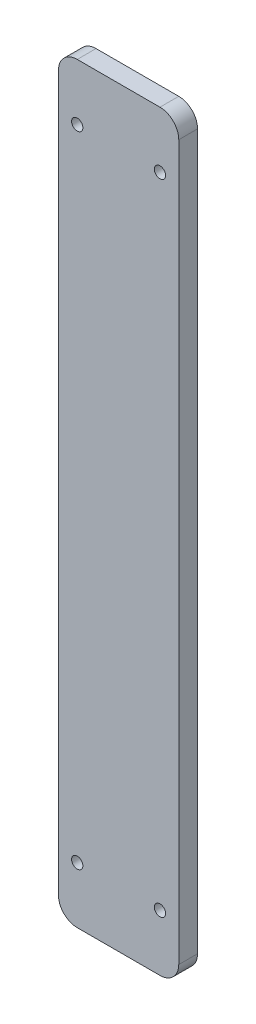
ISO-10303-21;
HEADER;
FILE_DESCRIPTION(('STEP AP214'),'2;1');
FILE_NAME('part.step','',(''),(''),'','','');
FILE_SCHEMA(('AUTOMOTIVE_DESIGN { 1 0 10303 214 1 1 1 1 }'));
ENDSEC;
DATA;
#1=APPLICATION_CONTEXT('core data for automotive mechanical design processes');
#2=APPLICATION_PROTOCOL_DEFINITION('international standard','automotive_design',2000,#1);
#3=PRODUCT_CONTEXT('',#1,'mechanical');
#4=PRODUCT('Part','Part','',(#3));
#5=PRODUCT_RELATED_PRODUCT_CATEGORY('part','',(#4));
#6=PRODUCT_DEFINITION_FORMATION('','',#4);
#7=PRODUCT_DEFINITION_CONTEXT('part definition',#1,'design');
#8=PRODUCT_DEFINITION('design','',#6,#7);
#9=PRODUCT_DEFINITION_SHAPE('','',#8);
#10=(LENGTH_UNIT() NAMED_UNIT(*) SI_UNIT(.MILLI.,.METRE.));
#11=(NAMED_UNIT(*) PLANE_ANGLE_UNIT() SI_UNIT($,.RADIAN.));
#12=(NAMED_UNIT(*) SI_UNIT($,.STERADIAN.) SOLID_ANGLE_UNIT());
#13=UNCERTAINTY_MEASURE_WITH_UNIT(LENGTH_MEASURE(1.E-05),#10,'distance_accuracy_value','');
#14=(GEOMETRIC_REPRESENTATION_CONTEXT(3) GLOBAL_UNCERTAINTY_ASSIGNED_CONTEXT((#13)) GLOBAL_UNIT_ASSIGNED_CONTEXT((#10,
#11,#12)) REPRESENTATION_CONTEXT('',''));
#15=CARTESIAN_POINT('',(0.,0.,0.));
#16=DIRECTION('',(0.,0.,1.));
#17=DIRECTION('',(1.,0.,0.));
#18=AXIS2_PLACEMENT_3D('',#15,#16,#17);
#19=CARTESIAN_POINT('',(16.,100.,5.));
#20=DIRECTION('',(-1.,0.,0.));
#21=DIRECTION('',(0.,-1.,0.));
#22=AXIS2_PLACEMENT_3D('',#19,#20,#21);
#23=PLANE('',#22);
#24=DIRECTION('',(0.,1.,0.));
#25=VECTOR('',#24,1.);
#26=CARTESIAN_POINT('',(16.,100.,5.));
#27=LINE('',#26,#25);
#28=CARTESIAN_POINT('',(16.,-95.,5.));
#29=VERTEX_POINT('',#28);
#30=CARTESIAN_POINT('',(16.,95.,5.));
#31=VERTEX_POINT('',#30);
#32=EDGE_CURVE('E128',#29,#31,#27,.T.);
#33=ORIENTED_EDGE('',*,*,#32,.F.);
#34=DIRECTION('',(0.,0.,-1.));
#35=VECTOR('',#34,1.);
#36=CARTESIAN_POINT('',(16.,-95.,5.));
#37=LINE('',#36,#35);
#38=CARTESIAN_POINT('',(16.,-95.,0.));
#39=VERTEX_POINT('',#38);
#40=EDGE_CURVE('E154',#29,#39,#37,.T.);
#41=ORIENTED_EDGE('',*,*,#40,.T.);
#42=DIRECTION('',(0.,1.,0.));
#43=VECTOR('',#42,1.);
#44=CARTESIAN_POINT('',(16.,100.,0.));
#45=LINE('',#44,#43);
#46=CARTESIAN_POINT('',(16.,95.,0.));
#47=VERTEX_POINT('',#46);
#48=EDGE_CURVE('E170',#39,#47,#45,.T.);
#49=ORIENTED_EDGE('',*,*,#48,.T.);
#50=DIRECTION('',(0.,0.,-1.));
#51=VECTOR('',#50,1.);
#52=CARTESIAN_POINT('',(16.,95.,5.));
#53=LINE('',#52,#51);
#54=EDGE_CURVE('E152',#47,#31,#53,.F.);
#55=ORIENTED_EDGE('',*,*,#54,.T.);
#56=EDGE_LOOP('',(#33,#41,#49,#55));
#57=FACE_BOUND('',#56,.T.);
#58=ADVANCED_FACE('F35',(#57),#23,.F.);
#59=CARTESIAN_POINT('',(-16.,100.,5.));
#60=DIRECTION('',(0.,-1.,0.));
#61=DIRECTION('',(0.,0.,-1.));
#62=AXIS2_PLACEMENT_3D('',#59,#60,#61);
#63=PLANE('',#62);
#64=DIRECTION('',(-1.,0.,0.));
#65=VECTOR('',#64,1.);
#66=CARTESIAN_POINT('',(-16.,100.,0.));
#67=LINE('',#66,#65);
#68=CARTESIAN_POINT('',(11.,100.,0.));
#69=VERTEX_POINT('',#68);
#70=CARTESIAN_POINT('',(-11.,100.,0.));
#71=VERTEX_POINT('',#70);
#72=EDGE_CURVE('E133',#69,#71,#67,.T.);
#73=ORIENTED_EDGE('',*,*,#72,.T.);
#74=DIRECTION('',(0.,0.,-1.));
#75=VECTOR('',#74,1.);
#76=CARTESIAN_POINT('',(-11.,100.,5.));
#77=LINE('',#76,#75);
#78=CARTESIAN_POINT('',(-11.,100.,5.));
#79=VERTEX_POINT('',#78);
#80=EDGE_CURVE('E11',#71,#79,#77,.F.);
#81=ORIENTED_EDGE('',*,*,#80,.T.);
#82=DIRECTION('',(-1.,0.,0.));
#83=VECTOR('',#82,1.);
#84=CARTESIAN_POINT('',(-16.,100.,5.));
#85=LINE('',#84,#83);
#86=CARTESIAN_POINT('',(11.,100.,5.));
#87=VERTEX_POINT('',#86);
#88=EDGE_CURVE('E131',#87,#79,#85,.T.);
#89=ORIENTED_EDGE('',*,*,#88,.F.);
#90=DIRECTION('',(0.,0.,-1.));
#91=VECTOR('',#90,1.);
#92=CARTESIAN_POINT('',(11.,100.,5.));
#93=LINE('',#92,#91);
#94=EDGE_CURVE('E44',#87,#69,#93,.T.);
#95=ORIENTED_EDGE('',*,*,#94,.T.);
#96=EDGE_LOOP('',(#73,#81,#89,#95));
#97=FACE_BOUND('',#96,.T.);
#98=ADVANCED_FACE('F212',(#97),#63,.F.);
#99=CARTESIAN_POINT('',(-16.,100.,5.));
#100=DIRECTION('',(1.,0.,0.));
#101=DIRECTION('',(0.,1.,0.));
#102=AXIS2_PLACEMENT_3D('',#99,#100,#101);
#103=PLANE('',#102);
#104=DIRECTION('',(0.,-1.,0.));
#105=VECTOR('',#104,1.);
#106=CARTESIAN_POINT('',(-16.,100.,0.));
#107=LINE('',#106,#105);
#108=CARTESIAN_POINT('',(-16.,95.,0.));
#109=VERTEX_POINT('',#108);
#110=CARTESIAN_POINT('',(-16.,-95.,0.));
#111=VERTEX_POINT('',#110);
#112=EDGE_CURVE('E129',#109,#111,#107,.T.);
#113=ORIENTED_EDGE('',*,*,#112,.T.);
#114=DIRECTION('',(0.,0.,-1.));
#115=VECTOR('',#114,1.);
#116=CARTESIAN_POINT('',(-16.,-95.,5.));
#117=LINE('',#116,#115);
#118=CARTESIAN_POINT('',(-16.,-95.,5.));
#119=VERTEX_POINT('',#118);
#120=EDGE_CURVE('E107',#111,#119,#117,.F.);
#121=ORIENTED_EDGE('',*,*,#120,.T.);
#122=DIRECTION('',(0.,-1.,0.));
#123=VECTOR('',#122,1.);
#124=CARTESIAN_POINT('',(-16.,100.,5.));
#125=LINE('',#124,#123);
#126=CARTESIAN_POINT('',(-16.,95.,5.));
#127=VERTEX_POINT('',#126);
#128=EDGE_CURVE('E179',#127,#119,#125,.T.);
#129=ORIENTED_EDGE('',*,*,#128,.F.);
#130=DIRECTION('',(0.,0.,-1.));
#131=VECTOR('',#130,1.);
#132=CARTESIAN_POINT('',(-16.,95.,5.));
#133=LINE('',#132,#131);
#134=EDGE_CURVE('E112',#127,#109,#133,.T.);
#135=ORIENTED_EDGE('',*,*,#134,.T.);
#136=EDGE_LOOP('',(#113,#121,#129,#135));
#137=FACE_BOUND('',#136,.T.);
#138=ADVANCED_FACE('F208',(#137),#103,.F.);
#139=CARTESIAN_POINT('',(-16.,-100.,5.));
#140=DIRECTION('',(0.,1.,0.));
#141=DIRECTION('',(0.,0.,1.));
#142=AXIS2_PLACEMENT_3D('',#139,#140,#141);
#143=PLANE('',#142);
#144=DIRECTION('',(1.,0.,0.));
#145=VECTOR('',#144,1.);
#146=CARTESIAN_POINT('',(-16.,-100.,5.));
#147=LINE('',#146,#145);
#148=CARTESIAN_POINT('',(-11.,-100.,5.));
#149=VERTEX_POINT('',#148);
#150=CARTESIAN_POINT('',(11.,-100.,5.));
#151=VERTEX_POINT('',#150);
#152=EDGE_CURVE('E122',#149,#151,#147,.T.);
#153=ORIENTED_EDGE('',*,*,#152,.F.);
#154=DIRECTION('',(0.,0.,-1.));
#155=VECTOR('',#154,1.);
#156=CARTESIAN_POINT('',(-11.,-100.,5.));
#157=LINE('',#156,#155);
#158=CARTESIAN_POINT('',(-11.,-100.,0.));
#159=VERTEX_POINT('',#158);
#160=EDGE_CURVE('E106',#149,#159,#157,.T.);
#161=ORIENTED_EDGE('',*,*,#160,.T.);
#162=DIRECTION('',(1.,0.,0.));
#163=VECTOR('',#162,1.);
#164=CARTESIAN_POINT('',(-16.,-100.,0.));
#165=LINE('',#164,#163);
#166=CARTESIAN_POINT('',(11.,-100.,0.));
#167=VERTEX_POINT('',#166);
#168=EDGE_CURVE('E119',#159,#167,#165,.T.);
#169=ORIENTED_EDGE('',*,*,#168,.T.);
#170=DIRECTION('',(0.,0.,-1.));
#171=VECTOR('',#170,1.);
#172=CARTESIAN_POINT('',(11.,-100.,5.));
#173=LINE('',#172,#171);
#174=EDGE_CURVE('E124',#167,#151,#173,.F.);
#175=ORIENTED_EDGE('',*,*,#174,.T.);
#176=EDGE_LOOP('',(#153,#161,#169,#175));
#177=FACE_BOUND('',#176,.T.);
#178=ADVANCED_FACE('F118',(#177),#143,.F.);
#179=CARTESIAN_POINT('',(0.,0.,5.));
#180=DIRECTION('',(0.,0.,1.));
#181=DIRECTION('',(1.,0.,0.));
#182=AXIS2_PLACEMENT_3D('',#179,#180,#181);
#183=PLANE('',#182);
#184=CARTESIAN_POINT('',(-11.,85.,5.));
#185=DIRECTION('',(0.,0.,1.));
#186=DIRECTION('',(-1.,0.,0.));
#187=AXIS2_PLACEMENT_3D('',#184,#185,#186);
#188=CIRCLE('',#187,1.5);
#189=CARTESIAN_POINT('',(-12.5,85.,5.));
#190=VERTEX_POINT('',#189);
#191=EDGE_CURVE('E186',#190,#190,#188,.T.);
#192=ORIENTED_EDGE('',*,*,#191,.F.);
#193=EDGE_LOOP('',(#192));
#194=FACE_BOUND('',#193,.T.);
#195=CARTESIAN_POINT('',(11.,85.,5.));
#196=DIRECTION('',(0.,0.,1.));
#197=DIRECTION('',(1.,0.,0.));
#198=AXIS2_PLACEMENT_3D('',#195,#196,#197);
#199=CIRCLE('',#198,1.5);
#200=CARTESIAN_POINT('',(12.5,85.,5.));
#201=VERTEX_POINT('',#200);
#202=EDGE_CURVE('E189',#201,#201,#199,.T.);
#203=ORIENTED_EDGE('',*,*,#202,.F.);
#204=EDGE_LOOP('',(#203));
#205=FACE_BOUND('',#204,.T.);
#206=CARTESIAN_POINT('',(11.,-85.,5.));
#207=DIRECTION('',(0.,0.,1.));
#208=DIRECTION('',(-1.,0.,0.));
#209=AXIS2_PLACEMENT_3D('',#206,#207,#208);
#210=CIRCLE('',#209,1.5);
#211=CARTESIAN_POINT('',(9.50000000000003,-85.,5.));
#212=VERTEX_POINT('',#211);
#213=EDGE_CURVE('E185',#212,#212,#210,.T.);
#214=ORIENTED_EDGE('',*,*,#213,.F.);
#215=EDGE_LOOP('',(#214));
#216=FACE_BOUND('',#215,.T.);
#217=CARTESIAN_POINT('',(-11.,-85.,5.));
#218=DIRECTION('',(0.,0.,1.));
#219=DIRECTION('',(1.,0.,0.));
#220=AXIS2_PLACEMENT_3D('',#217,#218,#219);
#221=CIRCLE('',#220,1.5);
#222=CARTESIAN_POINT('',(-9.49999999999998,-85.,5.));
#223=VERTEX_POINT('',#222);
#224=EDGE_CURVE('E163',#223,#223,#221,.T.);
#225=ORIENTED_EDGE('',*,*,#224,.F.);
#226=EDGE_LOOP('',(#225));
#227=FACE_BOUND('',#226,.T.);
#228=ORIENTED_EDGE('',*,*,#128,.T.);
#229=CARTESIAN_POINT('',(-11.,-95.,5.));
#230=DIRECTION('',(0.,0.,1.));
#231=DIRECTION('',(1.,0.,0.));
#232=AXIS2_PLACEMENT_3D('',#229,#230,#231);
#233=CIRCLE('',#232,5.);
#234=EDGE_CURVE('E150',#119,#149,#233,.T.);
#235=ORIENTED_EDGE('',*,*,#234,.T.);
#236=ORIENTED_EDGE('',*,*,#152,.T.);
#237=CARTESIAN_POINT('',(11.,-95.,5.));
#238=DIRECTION('',(0.,0.,1.));
#239=DIRECTION('',(1.,0.,0.));
#240=AXIS2_PLACEMENT_3D('',#237,#238,#239);
#241=CIRCLE('',#240,5.);
#242=EDGE_CURVE('E148',#151,#29,#241,.T.);
#243=ORIENTED_EDGE('',*,*,#242,.T.);
#244=ORIENTED_EDGE('',*,*,#32,.T.);
#245=CARTESIAN_POINT('',(11.,95.,5.));
#246=DIRECTION('',(0.,0.,1.));
#247=DIRECTION('',(1.,0.,0.));
#248=AXIS2_PLACEMENT_3D('',#245,#246,#247);
#249=CIRCLE('',#248,5.);
#250=EDGE_CURVE('E57',#31,#87,#249,.T.);
#251=ORIENTED_EDGE('',*,*,#250,.T.);
#252=ORIENTED_EDGE('',*,*,#88,.T.);
#253=CARTESIAN_POINT('',(-11.,95.,5.));
#254=DIRECTION('',(0.,0.,1.));
#255=DIRECTION('',(1.,0.,0.));
#256=AXIS2_PLACEMENT_3D('',#253,#254,#255);
#257=CIRCLE('',#256,5.);
#258=EDGE_CURVE('E146',#79,#127,#257,.T.);
#259=ORIENTED_EDGE('',*,*,#258,.T.);
#260=EDGE_LOOP('',(#228,#235,#236,#243,#244,#251,#252,#259));
#261=FACE_BOUND('',#260,.T.);
#262=ADVANCED_FACE('F198',(#194,#205,#216,#227,#261),#183,.T.);
#263=CARTESIAN_POINT('',(0.,0.,0.));
#264=DIRECTION('',(0.,0.,1.));
#265=DIRECTION('',(1.,0.,0.));
#266=AXIS2_PLACEMENT_3D('',#263,#264,#265);
#267=PLANE('',#266);
#268=CARTESIAN_POINT('',(-11.,85.,0.));
#269=DIRECTION('',(0.,0.,1.));
#270=DIRECTION('',(1.,0.,0.));
#271=AXIS2_PLACEMENT_3D('',#268,#269,#270);
#272=CIRCLE('',#271,1.5);
#273=CARTESIAN_POINT('',(-9.49999999999998,85.,0.));
#274=VERTEX_POINT('',#273);
#275=EDGE_CURVE('E39',#274,#274,#272,.T.);
#276=ORIENTED_EDGE('',*,*,#275,.T.);
#277=EDGE_LOOP('',(#276));
#278=FACE_BOUND('',#277,.T.);
#279=CARTESIAN_POINT('',(11.,85.,0.));
#280=DIRECTION('',(0.,0.,1.));
#281=DIRECTION('',(1.,0.,0.));
#282=AXIS2_PLACEMENT_3D('',#279,#280,#281);
#283=CIRCLE('',#282,1.5);
#284=CARTESIAN_POINT('',(12.5,85.,0.));
#285=VERTEX_POINT('',#284);
#286=EDGE_CURVE('E165',#285,#285,#283,.T.);
#287=ORIENTED_EDGE('',*,*,#286,.T.);
#288=EDGE_LOOP('',(#287));
#289=FACE_BOUND('',#288,.T.);
#290=CARTESIAN_POINT('',(11.,-85.,0.));
#291=DIRECTION('',(0.,0.,1.));
#292=DIRECTION('',(1.,0.,0.));
#293=AXIS2_PLACEMENT_3D('',#290,#291,#292);
#294=CIRCLE('',#293,1.5);
#295=CARTESIAN_POINT('',(12.5,-85.,0.));
#296=VERTEX_POINT('',#295);
#297=EDGE_CURVE('E162',#296,#296,#294,.T.);
#298=ORIENTED_EDGE('',*,*,#297,.T.);
#299=EDGE_LOOP('',(#298));
#300=FACE_BOUND('',#299,.T.);
#301=CARTESIAN_POINT('',(-11.,-85.,0.));
#302=DIRECTION('',(0.,0.,1.));
#303=DIRECTION('',(1.,0.,0.));
#304=AXIS2_PLACEMENT_3D('',#301,#302,#303);
#305=CIRCLE('',#304,1.5);
#306=CARTESIAN_POINT('',(-9.49999999999998,-85.,0.));
#307=VERTEX_POINT('',#306);
#308=EDGE_CURVE('E159',#307,#307,#305,.T.);
#309=ORIENTED_EDGE('',*,*,#308,.T.);
#310=EDGE_LOOP('',(#309));
#311=FACE_BOUND('',#310,.T.);
#312=ORIENTED_EDGE('',*,*,#168,.F.);
#313=CARTESIAN_POINT('',(-11.,-95.,0.));
#314=DIRECTION('',(0.,0.,1.));
#315=DIRECTION('',(1.,0.,0.));
#316=AXIS2_PLACEMENT_3D('',#313,#314,#315);
#317=CIRCLE('',#316,5.);
#318=EDGE_CURVE('E102',#159,#111,#317,.F.);
#319=ORIENTED_EDGE('',*,*,#318,.T.);
#320=ORIENTED_EDGE('',*,*,#112,.F.);
#321=CARTESIAN_POINT('',(-11.,95.,0.));
#322=DIRECTION('',(0.,0.,1.));
#323=DIRECTION('',(1.,0.,0.));
#324=AXIS2_PLACEMENT_3D('',#321,#322,#323);
#325=CIRCLE('',#324,5.);
#326=EDGE_CURVE('E139',#109,#71,#325,.F.);
#327=ORIENTED_EDGE('',*,*,#326,.T.);
#328=ORIENTED_EDGE('',*,*,#72,.F.);
#329=CARTESIAN_POINT('',(11.,95.,0.));
#330=DIRECTION('',(0.,0.,1.));
#331=DIRECTION('',(1.,0.,0.));
#332=AXIS2_PLACEMENT_3D('',#329,#330,#331);
#333=CIRCLE('',#332,5.);
#334=EDGE_CURVE('E123',#69,#47,#333,.F.);
#335=ORIENTED_EDGE('',*,*,#334,.T.);
#336=ORIENTED_EDGE('',*,*,#48,.F.);
#337=CARTESIAN_POINT('',(11.,-95.,0.));
#338=DIRECTION('',(0.,0.,1.));
#339=DIRECTION('',(1.,0.,0.));
#340=AXIS2_PLACEMENT_3D('',#337,#338,#339);
#341=CIRCLE('',#340,5.);
#342=EDGE_CURVE('E113',#39,#167,#341,.F.);
#343=ORIENTED_EDGE('',*,*,#342,.T.);
#344=EDGE_LOOP('',(#312,#319,#320,#327,#328,#335,#336,#343));
#345=FACE_BOUND('',#344,.T.);
#346=ADVANCED_FACE('F126',(#278,#289,#300,#311,#345),#267,.F.);
#347=CARTESIAN_POINT('',(-11.,-95.,5.));
#348=DIRECTION('',(0.,0.,-1.));
#349=DIRECTION('',(-1.,0.,0.));
#350=AXIS2_PLACEMENT_3D('',#347,#348,#349);
#351=CYLINDRICAL_SURFACE('',#350,5.);
#352=ORIENTED_EDGE('',*,*,#234,.F.);
#353=ORIENTED_EDGE('',*,*,#120,.F.);
#354=ORIENTED_EDGE('',*,*,#318,.F.);
#355=ORIENTED_EDGE('',*,*,#160,.F.);
#356=EDGE_LOOP('',(#352,#353,#354,#355));
#357=FACE_BOUND('',#356,.T.);
#358=ADVANCED_FACE('F105',(#357),#351,.T.);
#359=CARTESIAN_POINT('',(11.,-95.,5.));
#360=DIRECTION('',(0.,0.,-1.));
#361=DIRECTION('',(-1.,0.,0.));
#362=AXIS2_PLACEMENT_3D('',#359,#360,#361);
#363=CYLINDRICAL_SURFACE('',#362,5.);
#364=ORIENTED_EDGE('',*,*,#242,.F.);
#365=ORIENTED_EDGE('',*,*,#174,.F.);
#366=ORIENTED_EDGE('',*,*,#342,.F.);
#367=ORIENTED_EDGE('',*,*,#40,.F.);
#368=EDGE_LOOP('',(#364,#365,#366,#367));
#369=FACE_BOUND('',#368,.T.);
#370=ADVANCED_FACE('F219',(#369),#363,.T.);
#371=CARTESIAN_POINT('',(-11.,95.,5.));
#372=DIRECTION('',(0.,0.,-1.));
#373=DIRECTION('',(-1.,0.,0.));
#374=AXIS2_PLACEMENT_3D('',#371,#372,#373);
#375=CYLINDRICAL_SURFACE('',#374,5.);
#376=ORIENTED_EDGE('',*,*,#258,.F.);
#377=ORIENTED_EDGE('',*,*,#80,.F.);
#378=ORIENTED_EDGE('',*,*,#326,.F.);
#379=ORIENTED_EDGE('',*,*,#134,.F.);
#380=EDGE_LOOP('',(#376,#377,#378,#379));
#381=FACE_BOUND('',#380,.T.);
#382=ADVANCED_FACE('F210',(#381),#375,.T.);
#383=CARTESIAN_POINT('',(11.,95.,5.));
#384=DIRECTION('',(0.,0.,-1.));
#385=DIRECTION('',(-1.,0.,0.));
#386=AXIS2_PLACEMENT_3D('',#383,#384,#385);
#387=CYLINDRICAL_SURFACE('',#386,5.);
#388=ORIENTED_EDGE('',*,*,#250,.F.);
#389=ORIENTED_EDGE('',*,*,#54,.F.);
#390=ORIENTED_EDGE('',*,*,#334,.F.);
#391=ORIENTED_EDGE('',*,*,#94,.F.);
#392=EDGE_LOOP('',(#388,#389,#390,#391));
#393=FACE_BOUND('',#392,.T.);
#394=ADVANCED_FACE('F37',(#393),#387,.T.);
#395=CARTESIAN_POINT('',(-11.,-85.,-5.));
#396=DIRECTION('',(0.,0.,1.));
#397=DIRECTION('',(1.,0.,0.));
#398=AXIS2_PLACEMENT_3D('',#395,#396,#397);
#399=CYLINDRICAL_SURFACE('',#398,1.5);
#400=ORIENTED_EDGE('',*,*,#224,.T.);
#401=EDGE_LOOP('',(#400));
#402=FACE_BOUND('',#401,.T.);
#403=ORIENTED_EDGE('',*,*,#308,.F.);
#404=EDGE_LOOP('',(#403));
#405=FACE_BOUND('',#404,.T.);
#406=ADVANCED_FACE('F240',(#402,#405),#399,.F.);
#407=CARTESIAN_POINT('',(11.,-85.,-5.));
#408=DIRECTION('',(0.,0.,1.));
#409=DIRECTION('',(1.,0.,0.));
#410=AXIS2_PLACEMENT_3D('',#407,#408,#409);
#411=CYLINDRICAL_SURFACE('',#410,1.5);
#412=ORIENTED_EDGE('',*,*,#213,.T.);
#413=EDGE_LOOP('',(#412));
#414=FACE_BOUND('',#413,.T.);
#415=ORIENTED_EDGE('',*,*,#297,.F.);
#416=EDGE_LOOP('',(#415));
#417=FACE_BOUND('',#416,.T.);
#418=ADVANCED_FACE('F195',(#414,#417),#411,.F.);
#419=CARTESIAN_POINT('',(11.,85.,-5.));
#420=DIRECTION('',(0.,0.,1.));
#421=DIRECTION('',(1.,0.,0.));
#422=AXIS2_PLACEMENT_3D('',#419,#420,#421);
#423=CYLINDRICAL_SURFACE('',#422,1.5);
#424=ORIENTED_EDGE('',*,*,#202,.T.);
#425=EDGE_LOOP('',(#424));
#426=FACE_BOUND('',#425,.T.);
#427=ORIENTED_EDGE('',*,*,#286,.F.);
#428=EDGE_LOOP('',(#427));
#429=FACE_BOUND('',#428,.T.);
#430=ADVANCED_FACE('F247',(#426,#429),#423,.F.);
#431=CARTESIAN_POINT('',(-11.,85.,-5.));
#432=DIRECTION('',(0.,0.,1.));
#433=DIRECTION('',(1.,0.,0.));
#434=AXIS2_PLACEMENT_3D('',#431,#432,#433);
#435=CYLINDRICAL_SURFACE('',#434,1.5);
#436=ORIENTED_EDGE('',*,*,#191,.T.);
#437=EDGE_LOOP('',(#436));
#438=FACE_BOUND('',#437,.T.);
#439=ORIENTED_EDGE('',*,*,#275,.F.);
#440=EDGE_LOOP('',(#439));
#441=FACE_BOUND('',#440,.T.);
#442=ADVANCED_FACE('F244',(#438,#441),#435,.F.);
#443=CLOSED_SHELL('',(#58,#98,#138,#178,#262,#346,#358,#370,#382,#394,#406,#418,#430,#442));
#444=MANIFOLD_SOLID_BREP('B2',#443);
#445=ADVANCED_BREP_SHAPE_REPRESENTATION('',(#18,#444),#14);
#446=SHAPE_DEFINITION_REPRESENTATION(#9,#445);
ENDSEC;
END-ISO-10303-21;
